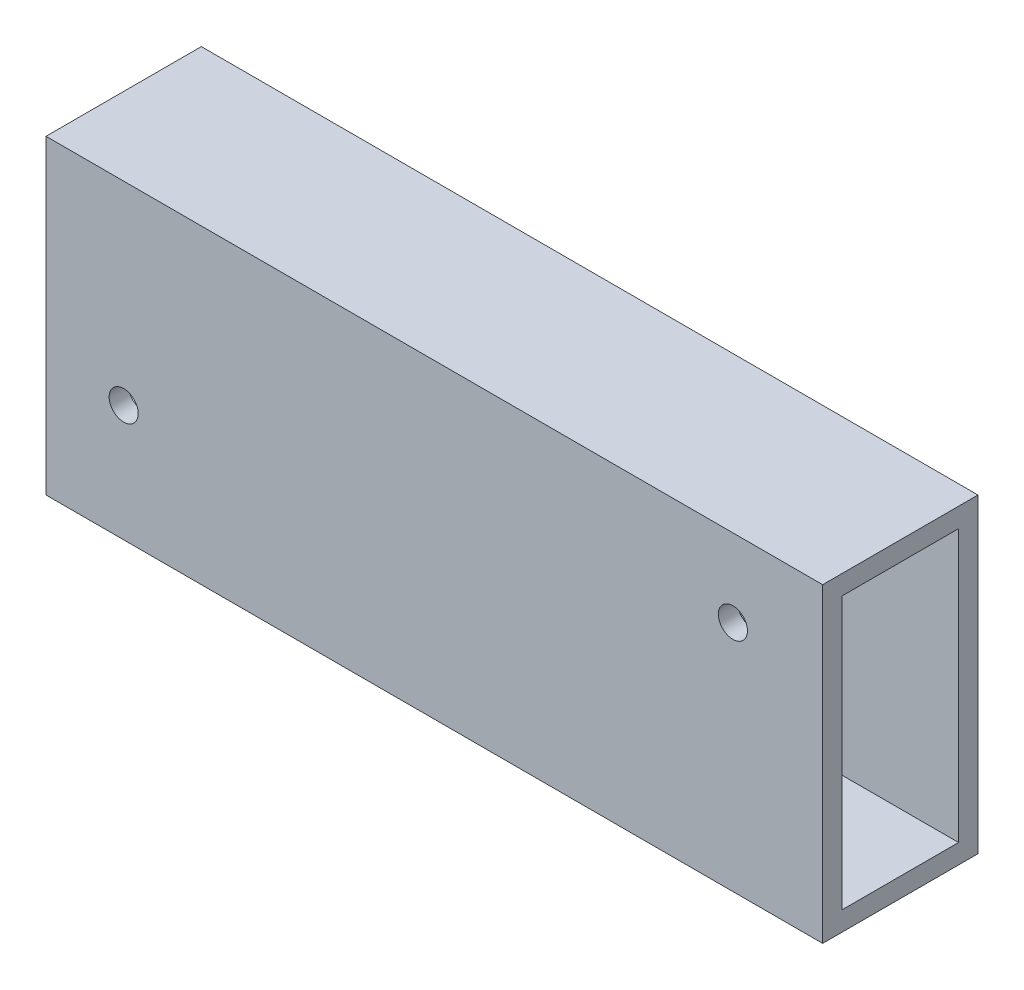
ISO-10303-21;
HEADER;
FILE_DESCRIPTION(('STEP AP214'),'2;1');
FILE_NAME('part.step','',(''),(''),'','','');
FILE_SCHEMA(('AUTOMOTIVE_DESIGN { 1 0 10303 214 1 1 1 1 }'));
ENDSEC;
DATA;
#1=APPLICATION_CONTEXT('core data for automotive mechanical design processes');
#2=APPLICATION_PROTOCOL_DEFINITION('international standard','automotive_design',2000,#1);
#3=PRODUCT_CONTEXT('',#1,'mechanical');
#4=PRODUCT('Part','Part','',(#3));
#5=PRODUCT_RELATED_PRODUCT_CATEGORY('part','',(#4));
#6=PRODUCT_DEFINITION_FORMATION('','',#4);
#7=PRODUCT_DEFINITION_CONTEXT('part definition',#1,'design');
#8=PRODUCT_DEFINITION('design','',#6,#7);
#9=PRODUCT_DEFINITION_SHAPE('','',#8);
#10=(LENGTH_UNIT() NAMED_UNIT(*) SI_UNIT(.MILLI.,.METRE.));
#11=(NAMED_UNIT(*) PLANE_ANGLE_UNIT() SI_UNIT($,.RADIAN.));
#12=(NAMED_UNIT(*) SI_UNIT($,.STERADIAN.) SOLID_ANGLE_UNIT());
#13=UNCERTAINTY_MEASURE_WITH_UNIT(LENGTH_MEASURE(1.E-05),#10,'distance_accuracy_value','');
#14=(GEOMETRIC_REPRESENTATION_CONTEXT(3) GLOBAL_UNCERTAINTY_ASSIGNED_CONTEXT((#13)) GLOBAL_UNIT_ASSIGNED_CONTEXT((#10,
#11,#12)) REPRESENTATION_CONTEXT('',''));
#15=CARTESIAN_POINT('',(0.,0.,0.));
#16=DIRECTION('',(0.,0.,1.));
#17=DIRECTION('',(1.,0.,0.));
#18=AXIS2_PLACEMENT_3D('',#15,#16,#17);
#19=CARTESIAN_POINT('',(127.,0.,0.));
#20=DIRECTION('',(1.,0.,0.));
#21=DIRECTION('',(0.,0.,-1.));
#22=AXIS2_PLACEMENT_3D('',#19,#20,#21);
#23=PLANE('',#22);
#24=DIRECTION('',(0.,-1.,0.));
#25=VECTOR('',#24,1.);
#26=CARTESIAN_POINT('',(127.,23.6926420824534,13.632940239234));
#27=LINE('',#26,#25);
#28=CARTESIAN_POINT('',(127.,23.6926420824534,13.632940239234));
#29=VERTEX_POINT('',#28);
#30=CARTESIAN_POINT('',(127.,-27.1073579175466,13.6329402392339));
#31=VERTEX_POINT('',#30);
#32=EDGE_CURVE('E138',#29,#31,#27,.T.);
#33=ORIENTED_EDGE('',*,*,#32,.T.);
#34=DIRECTION('',(0.,0.,-1.));
#35=VECTOR('',#34,1.);
#36=CARTESIAN_POINT('',(127.,-27.1073579175466,13.6329402392339));
#37=LINE('',#36,#35);
#38=CARTESIAN_POINT('',(127.,-27.1073579175466,-11.7670597607661));
#39=VERTEX_POINT('',#38);
#40=EDGE_CURVE('E141',#31,#39,#37,.T.);
#41=ORIENTED_EDGE('',*,*,#40,.T.);
#42=DIRECTION('',(0.,1.,0.));
#43=VECTOR('',#42,1.);
#44=CARTESIAN_POINT('',(127.,23.6926420824534,-11.767059760766));
#45=LINE('',#44,#43);
#46=CARTESIAN_POINT('',(127.,23.6926420824534,-11.767059760766));
#47=VERTEX_POINT('',#46);
#48=EDGE_CURVE('E144',#39,#47,#45,.T.);
#49=ORIENTED_EDGE('',*,*,#48,.T.);
#50=DIRECTION('',(0.,0.,1.));
#51=VECTOR('',#50,1.);
#52=CARTESIAN_POINT('',(127.,23.6926420824534,13.632940239234));
#53=LINE('',#52,#51);
#54=EDGE_CURVE('E146',#47,#29,#53,.T.);
#55=ORIENTED_EDGE('',*,*,#54,.T.);
#56=EDGE_LOOP('',(#33,#41,#49,#55));
#57=FACE_BOUND('',#56,.T.);
#58=DIRECTION('',(0.,0.,-1.));
#59=VECTOR('',#58,1.);
#60=CARTESIAN_POINT('',(127.,-23.9323579175466,10.457940239234));
#61=LINE('',#60,#59);
#62=CARTESIAN_POINT('',(127.,-23.9323579175466,10.457940239234));
#63=VERTEX_POINT('',#62);
#64=CARTESIAN_POINT('',(127.,-23.9323579175466,-8.59205976076606));
#65=VERTEX_POINT('',#64);
#66=EDGE_CURVE('E108',#63,#65,#61,.T.);
#67=ORIENTED_EDGE('',*,*,#66,.F.);
#68=DIRECTION('',(0.,-1.,0.));
#69=VECTOR('',#68,1.);
#70=CARTESIAN_POINT('',(127.,20.5176420824534,10.457940239234));
#71=LINE('',#70,#69);
#72=CARTESIAN_POINT('',(127.,20.5176420824534,10.457940239234));
#73=VERTEX_POINT('',#72);
#74=EDGE_CURVE('E100',#73,#63,#71,.T.);
#75=ORIENTED_EDGE('',*,*,#74,.F.);
#76=DIRECTION('',(0.,0.,1.));
#77=VECTOR('',#76,1.);
#78=CARTESIAN_POINT('',(127.,20.5176420824534,10.457940239234));
#79=LINE('',#78,#77);
#80=CARTESIAN_POINT('',(127.,20.5176420824534,-8.59205976076605));
#81=VERTEX_POINT('',#80);
#82=EDGE_CURVE('E122',#81,#73,#79,.T.);
#83=ORIENTED_EDGE('',*,*,#82,.F.);
#84=DIRECTION('',(0.,1.,0.));
#85=VECTOR('',#84,1.);
#86=CARTESIAN_POINT('',(127.,20.5176420824534,-8.59205976076605));
#87=LINE('',#86,#85);
#88=EDGE_CURVE('E120',#65,#81,#87,.T.);
#89=ORIENTED_EDGE('',*,*,#88,.F.);
#90=EDGE_LOOP('',(#67,#75,#83,#89));
#91=FACE_BOUND('',#90,.T.);
#92=ADVANCED_FACE('F33',(#57,#91),#23,.T.);
#93=CARTESIAN_POINT('',(0.,0.,0.));
#94=DIRECTION('',(1.,0.,0.));
#95=DIRECTION('',(0.,0.,-1.));
#96=AXIS2_PLACEMENT_3D('',#93,#94,#95);
#97=PLANE('',#96);
#98=DIRECTION('',(0.,-1.,0.));
#99=VECTOR('',#98,1.);
#100=CARTESIAN_POINT('',(0.,23.6926420824534,13.632940239234));
#101=LINE('',#100,#99);
#102=CARTESIAN_POINT('',(0.,23.6926420824534,13.632940239234));
#103=VERTEX_POINT('',#102);
#104=CARTESIAN_POINT('',(0.,-27.1073579175466,13.6329402392339));
#105=VERTEX_POINT('',#104);
#106=EDGE_CURVE('E116',#103,#105,#101,.T.);
#107=ORIENTED_EDGE('',*,*,#106,.F.);
#108=DIRECTION('',(0.,0.,1.));
#109=VECTOR('',#108,1.);
#110=CARTESIAN_POINT('',(0.,23.6926420824534,13.632940239234));
#111=LINE('',#110,#109);
#112=CARTESIAN_POINT('',(0.,23.6926420824534,-11.767059760766));
#113=VERTEX_POINT('',#112);
#114=EDGE_CURVE('E142',#113,#103,#111,.T.);
#115=ORIENTED_EDGE('',*,*,#114,.F.);
#116=DIRECTION('',(0.,1.,0.));
#117=VECTOR('',#116,1.);
#118=CARTESIAN_POINT('',(0.,23.6926420824534,-11.767059760766));
#119=LINE('',#118,#117);
#120=CARTESIAN_POINT('',(0.,-27.1073579175466,-11.7670597607661));
#121=VERTEX_POINT('',#120);
#122=EDGE_CURVE('E153',#121,#113,#119,.T.);
#123=ORIENTED_EDGE('',*,*,#122,.F.);
#124=DIRECTION('',(0.,0.,-1.));
#125=VECTOR('',#124,1.);
#126=CARTESIAN_POINT('',(0.,-27.1073579175466,13.6329402392339));
#127=LINE('',#126,#125);
#128=EDGE_CURVE('E151',#105,#121,#127,.T.);
#129=ORIENTED_EDGE('',*,*,#128,.F.);
#130=EDGE_LOOP('',(#107,#115,#123,#129));
#131=FACE_BOUND('',#130,.T.);
#132=DIRECTION('',(0.,-1.,0.));
#133=VECTOR('',#132,1.);
#134=CARTESIAN_POINT('',(0.,20.5176420824534,10.457940239234));
#135=LINE('',#134,#133);
#136=CARTESIAN_POINT('',(0.,20.5176420824534,10.457940239234));
#137=VERTEX_POINT('',#136);
#138=CARTESIAN_POINT('',(0.,-23.9323579175466,10.457940239234));
#139=VERTEX_POINT('',#138);
#140=EDGE_CURVE('E58',#137,#139,#135,.T.);
#141=ORIENTED_EDGE('',*,*,#140,.T.);
#142=DIRECTION('',(0.,0.,-1.));
#143=VECTOR('',#142,1.);
#144=CARTESIAN_POINT('',(0.,-23.9323579175466,10.457940239234));
#145=LINE('',#144,#143);
#146=CARTESIAN_POINT('',(0.,-23.9323579175466,-8.59205976076606));
#147=VERTEX_POINT('',#146);
#148=EDGE_CURVE('E115',#139,#147,#145,.T.);
#149=ORIENTED_EDGE('',*,*,#148,.T.);
#150=DIRECTION('',(0.,1.,0.));
#151=VECTOR('',#150,1.);
#152=CARTESIAN_POINT('',(0.,20.5176420824534,-8.59205976076605));
#153=LINE('',#152,#151);
#154=CARTESIAN_POINT('',(0.,20.5176420824534,-8.59205976076605));
#155=VERTEX_POINT('',#154);
#156=EDGE_CURVE('E130',#147,#155,#153,.T.);
#157=ORIENTED_EDGE('',*,*,#156,.T.);
#158=DIRECTION('',(0.,0.,1.));
#159=VECTOR('',#158,1.);
#160=CARTESIAN_POINT('',(0.,20.5176420824534,10.457940239234));
#161=LINE('',#160,#159);
#162=EDGE_CURVE('E109',#155,#137,#161,.T.);
#163=ORIENTED_EDGE('',*,*,#162,.T.);
#164=EDGE_LOOP('',(#141,#149,#157,#163));
#165=FACE_BOUND('',#164,.T.);
#166=ADVANCED_FACE('F200',(#131,#165),#97,.F.);
#167=CARTESIAN_POINT('',(127.,23.6926420824534,13.632940239234));
#168=DIRECTION('',(0.,0.,-1.));
#169=DIRECTION('',(0.,1.,0.));
#170=AXIS2_PLACEMENT_3D('',#167,#168,#169);
#171=PLANE('',#170);
#172=CARTESIAN_POINT('',(112.320186582978,10.9926420824534,13.632940239234));
#173=DIRECTION('',(0.,0.,1.));
#174=DIRECTION('',(1.,0.,0.));
#175=AXIS2_PLACEMENT_3D('',#172,#173,#174);
#176=CIRCLE('',#175,2.38125000000001);
#177=CARTESIAN_POINT('',(114.701436582978,10.9926420824534,13.632940239234));
#178=VERTEX_POINT('',#177);
#179=EDGE_CURVE('E179',#178,#178,#176,.T.);
#180=ORIENTED_EDGE('',*,*,#179,.F.);
#181=EDGE_LOOP('',(#180));
#182=FACE_BOUND('',#181,.T.);
#183=CARTESIAN_POINT('',(12.7,-8.05735791754661,13.632940239234));
#184=DIRECTION('',(0.,0.,1.));
#185=DIRECTION('',(1.,0.,0.));
#186=AXIS2_PLACEMENT_3D('',#183,#184,#185);
#187=CIRCLE('',#186,2.38125);
#188=CARTESIAN_POINT('',(15.08125,-8.05735791754661,13.632940239234));
#189=VERTEX_POINT('',#188);
#190=EDGE_CURVE('E169',#189,#189,#187,.T.);
#191=ORIENTED_EDGE('',*,*,#190,.F.);
#192=EDGE_LOOP('',(#191));
#193=FACE_BOUND('',#192,.T.);
#194=ORIENTED_EDGE('',*,*,#106,.T.);
#195=DIRECTION('',(-1.,0.,0.));
#196=VECTOR('',#195,1.);
#197=CARTESIAN_POINT('',(127.,-27.1073579175466,13.6329402392339));
#198=LINE('',#197,#196);
#199=EDGE_CURVE('E11',#31,#105,#198,.T.);
#200=ORIENTED_EDGE('',*,*,#199,.F.);
#201=ORIENTED_EDGE('',*,*,#32,.F.);
#202=DIRECTION('',(-1.,0.,0.));
#203=VECTOR('',#202,1.);
#204=CARTESIAN_POINT('',(127.,23.6926420824534,13.632940239234));
#205=LINE('',#204,#203);
#206=EDGE_CURVE('E148',#29,#103,#205,.T.);
#207=ORIENTED_EDGE('',*,*,#206,.T.);
#208=EDGE_LOOP('',(#194,#200,#201,#207));
#209=FACE_BOUND('',#208,.T.);
#210=ADVANCED_FACE('F35',(#182,#193,#209),#171,.F.);
#211=CARTESIAN_POINT('',(127.,-27.1073579175466,13.6329402392339));
#212=DIRECTION('',(0.,1.,0.));
#213=DIRECTION('',(0.,0.,1.));
#214=AXIS2_PLACEMENT_3D('',#211,#212,#213);
#215=PLANE('',#214);
#216=ORIENTED_EDGE('',*,*,#128,.T.);
#217=DIRECTION('',(-1.,0.,0.));
#218=VECTOR('',#217,1.);
#219=CARTESIAN_POINT('',(127.,-27.1073579175466,-11.7670597607661));
#220=LINE('',#219,#218);
#221=EDGE_CURVE('E42',#39,#121,#220,.T.);
#222=ORIENTED_EDGE('',*,*,#221,.F.);
#223=ORIENTED_EDGE('',*,*,#40,.F.);
#224=ORIENTED_EDGE('',*,*,#199,.T.);
#225=EDGE_LOOP('',(#216,#222,#223,#224));
#226=FACE_BOUND('',#225,.T.);
#227=ADVANCED_FACE('F226',(#226),#215,.F.);
#228=CARTESIAN_POINT('',(127.,23.6926420824534,-11.767059760766));
#229=DIRECTION('',(0.,0.,1.));
#230=DIRECTION('',(0.,-1.,0.));
#231=AXIS2_PLACEMENT_3D('',#228,#229,#230);
#232=PLANE('',#231);
#233=CARTESIAN_POINT('',(112.320186582978,10.9926420824534,-11.767059760766));
#234=DIRECTION('',(0.,0.,1.));
#235=DIRECTION('',(1.,0.,0.));
#236=AXIS2_PLACEMENT_3D('',#233,#234,#235);
#237=CIRCLE('',#236,2.38125000000001);
#238=CARTESIAN_POINT('',(114.701436582978,10.9926420824534,-11.767059760766));
#239=VERTEX_POINT('',#238);
#240=EDGE_CURVE('E182',#239,#239,#237,.T.);
#241=ORIENTED_EDGE('',*,*,#240,.T.);
#242=EDGE_LOOP('',(#241));
#243=FACE_BOUND('',#242,.T.);
#244=CARTESIAN_POINT('',(12.7,-8.05735791754661,-11.767059760766));
#245=DIRECTION('',(0.,0.,1.));
#246=DIRECTION('',(1.,0.,0.));
#247=AXIS2_PLACEMENT_3D('',#244,#245,#246);
#248=CIRCLE('',#247,2.38125);
#249=CARTESIAN_POINT('',(15.08125,-8.05735791754661,-11.767059760766));
#250=VERTEX_POINT('',#249);
#251=EDGE_CURVE('E164',#250,#250,#248,.T.);
#252=ORIENTED_EDGE('',*,*,#251,.T.);
#253=EDGE_LOOP('',(#252));
#254=FACE_BOUND('',#253,.T.);
#255=ORIENTED_EDGE('',*,*,#122,.T.);
#256=DIRECTION('',(-1.,0.,0.));
#257=VECTOR('',#256,1.);
#258=CARTESIAN_POINT('',(127.,23.6926420824534,-11.767059760766));
#259=LINE('',#258,#257);
#260=EDGE_CURVE('E158',#47,#113,#259,.T.);
#261=ORIENTED_EDGE('',*,*,#260,.F.);
#262=ORIENTED_EDGE('',*,*,#48,.F.);
#263=ORIENTED_EDGE('',*,*,#221,.T.);
#264=EDGE_LOOP('',(#255,#261,#262,#263));
#265=FACE_BOUND('',#264,.T.);
#266=ADVANCED_FACE('F223',(#243,#254,#265),#232,.F.);
#267=CARTESIAN_POINT('',(127.,23.6926420824534,13.632940239234));
#268=DIRECTION('',(0.,-1.,0.));
#269=DIRECTION('',(0.,0.,-1.));
#270=AXIS2_PLACEMENT_3D('',#267,#268,#269);
#271=PLANE('',#270);
#272=ORIENTED_EDGE('',*,*,#114,.T.);
#273=ORIENTED_EDGE('',*,*,#206,.F.);
#274=ORIENTED_EDGE('',*,*,#54,.F.);
#275=ORIENTED_EDGE('',*,*,#260,.T.);
#276=EDGE_LOOP('',(#272,#273,#274,#275));
#277=FACE_BOUND('',#276,.T.);
#278=ADVANCED_FACE('F220',(#277),#271,.F.);
#279=CARTESIAN_POINT('',(127.,20.5176420824534,10.457940239234));
#280=DIRECTION('',(0.,0.,-1.));
#281=DIRECTION('',(-1.,0.,0.));
#282=AXIS2_PLACEMENT_3D('',#279,#280,#281);
#283=PLANE('',#282);
#284=CARTESIAN_POINT('',(112.320186582978,10.9926420824534,10.457940239234));
#285=DIRECTION('',(0.,0.,-1.));
#286=DIRECTION('',(-1.,0.,0.));
#287=AXIS2_PLACEMENT_3D('',#284,#285,#286);
#288=CIRCLE('',#287,2.38125000000001);
#289=CARTESIAN_POINT('',(109.938936582978,10.9926420824534,10.457940239234));
#290=VERTEX_POINT('',#289);
#291=EDGE_CURVE('E174',#290,#290,#288,.T.);
#292=ORIENTED_EDGE('',*,*,#291,.F.);
#293=EDGE_LOOP('',(#292));
#294=FACE_BOUND('',#293,.T.);
#295=CARTESIAN_POINT('',(12.7,-8.05735791754661,10.457940239234));
#296=DIRECTION('',(0.,0.,-1.));
#297=DIRECTION('',(-1.,0.,0.));
#298=AXIS2_PLACEMENT_3D('',#295,#296,#297);
#299=CIRCLE('',#298,2.38125);
#300=CARTESIAN_POINT('',(10.31875,-8.05735791754661,10.457940239234));
#301=VERTEX_POINT('',#300);
#302=EDGE_CURVE('E128',#301,#301,#299,.T.);
#303=ORIENTED_EDGE('',*,*,#302,.F.);
#304=EDGE_LOOP('',(#303));
#305=FACE_BOUND('',#304,.T.);
#306=ORIENTED_EDGE('',*,*,#140,.F.);
#307=DIRECTION('',(-1.,0.,0.));
#308=VECTOR('',#307,1.);
#309=CARTESIAN_POINT('',(127.,20.5176420824534,10.457940239234));
#310=LINE('',#309,#308);
#311=EDGE_CURVE('E104',#73,#137,#310,.T.);
#312=ORIENTED_EDGE('',*,*,#311,.F.);
#313=ORIENTED_EDGE('',*,*,#74,.T.);
#314=DIRECTION('',(-1.,0.,0.));
#315=VECTOR('',#314,1.);
#316=CARTESIAN_POINT('',(127.,-23.9323579175466,10.457940239234));
#317=LINE('',#316,#315);
#318=EDGE_CURVE('E103',#63,#139,#317,.T.);
#319=ORIENTED_EDGE('',*,*,#318,.T.);
#320=EDGE_LOOP('',(#306,#312,#313,#319));
#321=FACE_BOUND('',#320,.T.);
#322=ADVANCED_FACE('F102',(#294,#305,#321),#283,.T.);
#323=CARTESIAN_POINT('',(127.,-23.9323579175466,10.457940239234));
#324=DIRECTION('',(0.,1.,0.));
#325=DIRECTION('',(0.,0.,1.));
#326=AXIS2_PLACEMENT_3D('',#323,#324,#325);
#327=PLANE('',#326);
#328=ORIENTED_EDGE('',*,*,#148,.F.);
#329=ORIENTED_EDGE('',*,*,#318,.F.);
#330=ORIENTED_EDGE('',*,*,#66,.T.);
#331=DIRECTION('',(-1.,0.,0.));
#332=VECTOR('',#331,1.);
#333=CARTESIAN_POINT('',(127.,-23.9323579175466,-8.59205976076606));
#334=LINE('',#333,#332);
#335=EDGE_CURVE('E117',#65,#147,#334,.T.);
#336=ORIENTED_EDGE('',*,*,#335,.T.);
#337=EDGE_LOOP('',(#328,#329,#330,#336));
#338=FACE_BOUND('',#337,.T.);
#339=ADVANCED_FACE('F112',(#338),#327,.T.);
#340=CARTESIAN_POINT('',(127.,20.5176420824534,-8.59205976076605));
#341=DIRECTION('',(0.,0.,1.));
#342=DIRECTION('',(0.,-1.,0.));
#343=AXIS2_PLACEMENT_3D('',#340,#341,#342);
#344=PLANE('',#343);
#345=CARTESIAN_POINT('',(112.320186582978,10.9926420824534,-8.59205976076605));
#346=DIRECTION('',(0.,0.,1.));
#347=DIRECTION('',(0.,-1.,0.));
#348=AXIS2_PLACEMENT_3D('',#345,#346,#347);
#349=CIRCLE('',#348,2.38125000000001);
#350=CARTESIAN_POINT('',(112.320186582978,8.61139208245339,-8.59205976076605));
#351=VERTEX_POINT('',#350);
#352=EDGE_CURVE('E37',#351,#351,#349,.T.);
#353=ORIENTED_EDGE('',*,*,#352,.F.);
#354=EDGE_LOOP('',(#353));
#355=FACE_BOUND('',#354,.T.);
#356=CARTESIAN_POINT('',(12.7,-8.05735791754661,-8.59205976076605));
#357=DIRECTION('',(0.,0.,1.));
#358=DIRECTION('',(0.,-1.,0.));
#359=AXIS2_PLACEMENT_3D('',#356,#357,#358);
#360=CIRCLE('',#359,2.38125);
#361=CARTESIAN_POINT('',(12.7,-10.4386079175466,-8.59205976076605));
#362=VERTEX_POINT('',#361);
#363=EDGE_CURVE('E162',#362,#362,#360,.T.);
#364=ORIENTED_EDGE('',*,*,#363,.F.);
#365=EDGE_LOOP('',(#364));
#366=FACE_BOUND('',#365,.T.);
#367=ORIENTED_EDGE('',*,*,#156,.F.);
#368=ORIENTED_EDGE('',*,*,#335,.F.);
#369=ORIENTED_EDGE('',*,*,#88,.T.);
#370=DIRECTION('',(-1.,0.,0.));
#371=VECTOR('',#370,1.);
#372=CARTESIAN_POINT('',(127.,20.5176420824534,-8.59205976076605));
#373=LINE('',#372,#371);
#374=EDGE_CURVE('E50',#81,#155,#373,.T.);
#375=ORIENTED_EDGE('',*,*,#374,.T.);
#376=EDGE_LOOP('',(#367,#368,#369,#375));
#377=FACE_BOUND('',#376,.T.);
#378=ADVANCED_FACE('F192',(#355,#366,#377),#344,.T.);
#379=CARTESIAN_POINT('',(127.,20.5176420824534,10.457940239234));
#380=DIRECTION('',(0.,-1.,0.));
#381=DIRECTION('',(0.,0.,-1.));
#382=AXIS2_PLACEMENT_3D('',#379,#380,#381);
#383=PLANE('',#382);
#384=ORIENTED_EDGE('',*,*,#162,.F.);
#385=ORIENTED_EDGE('',*,*,#374,.F.);
#386=ORIENTED_EDGE('',*,*,#82,.T.);
#387=ORIENTED_EDGE('',*,*,#311,.T.);
#388=EDGE_LOOP('',(#384,#385,#386,#387));
#389=FACE_BOUND('',#388,.T.);
#390=ADVANCED_FACE('F195',(#389),#383,.T.);
#391=CARTESIAN_POINT('',(12.7,-8.05735791754661,-11.767059760766));
#392=DIRECTION('',(0.,0.,1.));
#393=DIRECTION('',(1.,0.,0.));
#394=AXIS2_PLACEMENT_3D('',#391,#392,#393);
#395=CYLINDRICAL_SURFACE('',#394,2.38125);
#396=ORIENTED_EDGE('',*,*,#363,.T.);
#397=EDGE_LOOP('',(#396));
#398=FACE_BOUND('',#397,.T.);
#399=ORIENTED_EDGE('',*,*,#251,.F.);
#400=EDGE_LOOP('',(#399));
#401=FACE_BOUND('',#400,.T.);
#402=ADVANCED_FACE('F202',(#398,#401),#395,.F.);
#403=ORIENTED_EDGE('',*,*,#302,.T.);
#404=EDGE_LOOP('',(#403));
#405=FACE_BOUND('',#404,.T.);
#406=ORIENTED_EDGE('',*,*,#190,.T.);
#407=EDGE_LOOP('',(#406));
#408=FACE_BOUND('',#407,.T.);
#409=ADVANCED_FACE('F207',(#405,#408),#395,.F.);
#410=CARTESIAN_POINT('',(112.320186582978,10.9926420824534,-11.767059760766));
#411=DIRECTION('',(0.,0.,1.));
#412=DIRECTION('',(1.,0.,0.));
#413=AXIS2_PLACEMENT_3D('',#410,#411,#412);
#414=CYLINDRICAL_SURFACE('',#413,2.38125000000001);
#415=ORIENTED_EDGE('',*,*,#352,.T.);
#416=EDGE_LOOP('',(#415));
#417=FACE_BOUND('',#416,.T.);
#418=ORIENTED_EDGE('',*,*,#240,.F.);
#419=EDGE_LOOP('',(#418));
#420=FACE_BOUND('',#419,.T.);
#421=ADVANCED_FACE('F189',(#417,#420),#414,.F.);
#422=ORIENTED_EDGE('',*,*,#291,.T.);
#423=EDGE_LOOP('',(#422));
#424=FACE_BOUND('',#423,.T.);
#425=ORIENTED_EDGE('',*,*,#179,.T.);
#426=EDGE_LOOP('',(#425));
#427=FACE_BOUND('',#426,.T.);
#428=ADVANCED_FACE('F256',(#424,#427),#414,.F.);
#429=CLOSED_SHELL('',(#92,#166,#210,#227,#266,#278,#322,#339,#378,#390,#402,#409,#421,#428));
#430=MANIFOLD_SOLID_BREP('B2',#429);
#431=ADVANCED_BREP_SHAPE_REPRESENTATION('',(#18,#430),#14);
#432=SHAPE_DEFINITION_REPRESENTATION(#9,#431);
ENDSEC;
END-ISO-10303-21;
